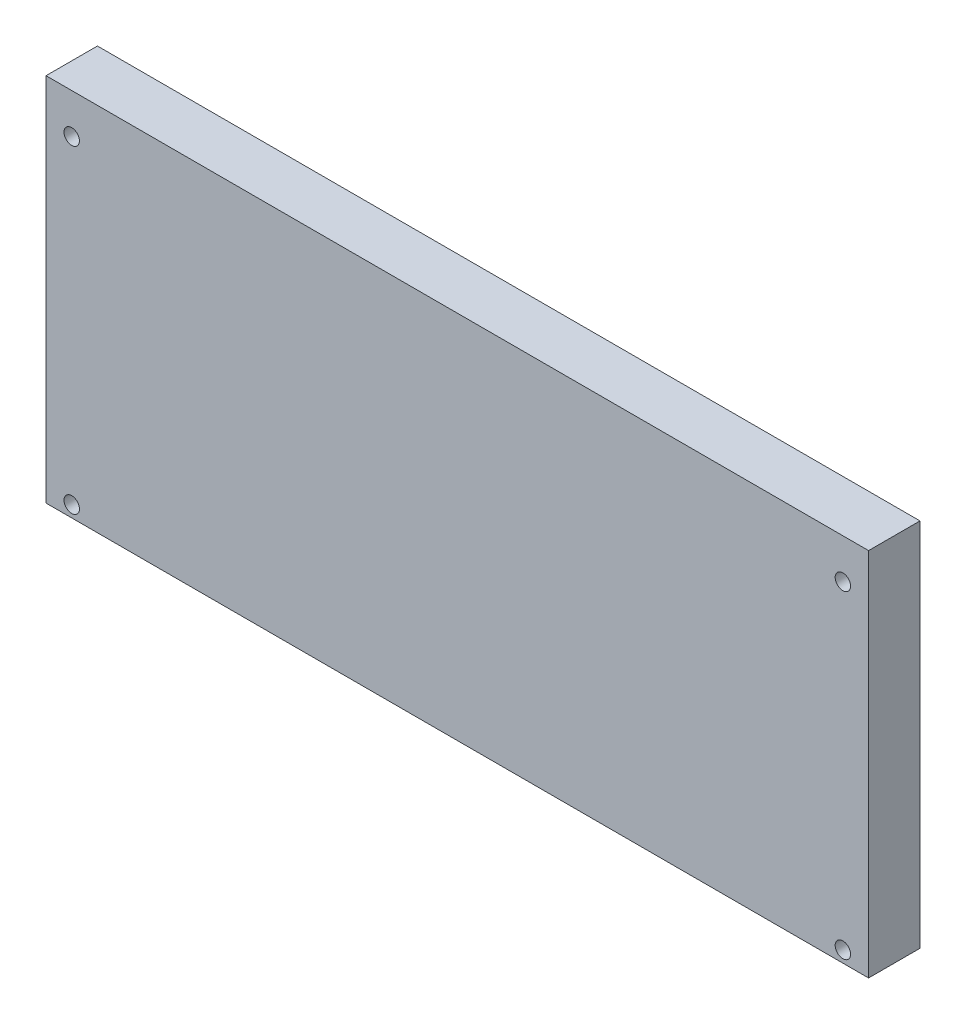
ISO-10303-21;
HEADER;
FILE_DESCRIPTION(('STEP AP214'),'2;1');
FILE_NAME('part.step','',(''),(''),'','','');
FILE_SCHEMA(('AUTOMOTIVE_DESIGN { 1 0 10303 214 1 1 1 1 }'));
ENDSEC;
DATA;
#1=APPLICATION_CONTEXT('core data for automotive mechanical design processes');
#2=APPLICATION_PROTOCOL_DEFINITION('international standard','automotive_design',2000,#1);
#3=PRODUCT_CONTEXT('',#1,'mechanical');
#4=PRODUCT('Part','Part','',(#3));
#5=PRODUCT_RELATED_PRODUCT_CATEGORY('part','',(#4));
#6=PRODUCT_DEFINITION_FORMATION('','',#4);
#7=PRODUCT_DEFINITION_CONTEXT('part definition',#1,'design');
#8=PRODUCT_DEFINITION('design','',#6,#7);
#9=PRODUCT_DEFINITION_SHAPE('','',#8);
#10=(LENGTH_UNIT() NAMED_UNIT(*) SI_UNIT(.MILLI.,.METRE.));
#11=(NAMED_UNIT(*) PLANE_ANGLE_UNIT() SI_UNIT($,.RADIAN.));
#12=(NAMED_UNIT(*) SI_UNIT($,.STERADIAN.) SOLID_ANGLE_UNIT());
#13=UNCERTAINTY_MEASURE_WITH_UNIT(LENGTH_MEASURE(1.E-05),#10,'distance_accuracy_value','');
#14=(GEOMETRIC_REPRESENTATION_CONTEXT(3) GLOBAL_UNCERTAINTY_ASSIGNED_CONTEXT((#13)) GLOBAL_UNIT_ASSIGNED_CONTEXT((#10,
#11,#12)) REPRESENTATION_CONTEXT('',''));
#15=CARTESIAN_POINT('',(0.,0.,0.));
#16=DIRECTION('',(0.,0.,1.));
#17=DIRECTION('',(1.,0.,0.));
#18=AXIS2_PLACEMENT_3D('',#15,#16,#17);
#19=CARTESIAN_POINT('',(0.,0.,0.));
#20=DIRECTION('',(0.,0.,-1.));
#21=DIRECTION('',(-1.,0.,0.));
#22=AXIS2_PLACEMENT_3D('',#19,#20,#21);
#23=PLANE('',#22);
#24=CARTESIAN_POINT('',(336.03196475352,25.5070546999659,0.));
#25=DIRECTION('',(0.,0.,-1.));
#26=DIRECTION('',(-1.,0.,0.));
#27=AXIS2_PLACEMENT_3D('',#24,#25,#26);
#28=CIRCLE('',#27,0.749999999999983);
#29=CARTESIAN_POINT('',(335.28196475352,25.5070546999659,0.));
#30=VERTEX_POINT('',#29);
#31=EDGE_CURVE('E218',#30,#30,#28,.F.);
#32=ORIENTED_EDGE('',*,*,#31,.T.);
#33=EDGE_LOOP('',(#32));
#34=FACE_BOUND('',#33,.T.);
#35=CARTESIAN_POINT('',(336.03196475352,56.5070546999659,0.));
#36=DIRECTION('',(0.,0.,-1.));
#37=DIRECTION('',(-1.,0.,0.));
#38=AXIS2_PLACEMENT_3D('',#35,#36,#37);
#39=CIRCLE('',#38,0.749999999999983);
#40=CARTESIAN_POINT('',(335.28196475352,56.5070546999659,0.));
#41=VERTEX_POINT('',#40);
#42=EDGE_CURVE('E232',#41,#41,#39,.F.);
#43=ORIENTED_EDGE('',*,*,#42,.T.);
#44=EDGE_LOOP('',(#43));
#45=FACE_BOUND('',#44,.T.);
#46=CARTESIAN_POINT('',(261.031964753519,56.5070546999659,0.));
#47=DIRECTION('',(0.,0.,-1.));
#48=DIRECTION('',(-1.,0.,0.));
#49=AXIS2_PLACEMENT_3D('',#46,#47,#48);
#50=CIRCLE('',#49,0.750000000000041);
#51=CARTESIAN_POINT('',(260.281964753519,56.5070546999659,0.));
#52=VERTEX_POINT('',#51);
#53=EDGE_CURVE('E238',#52,#52,#50,.F.);
#54=ORIENTED_EDGE('',*,*,#53,.T.);
#55=EDGE_LOOP('',(#54));
#56=FACE_BOUND('',#55,.T.);
#57=CARTESIAN_POINT('',(261.031964753519,25.5070546999659,0.));
#58=DIRECTION('',(0.,0.,-1.));
#59=DIRECTION('',(-1.,0.,0.));
#60=AXIS2_PLACEMENT_3D('',#57,#58,#59);
#61=CIRCLE('',#60,0.749999999999983);
#62=CARTESIAN_POINT('',(260.28196475352,25.5070546999659,0.));
#63=VERTEX_POINT('',#62);
#64=EDGE_CURVE('E222',#63,#63,#61,.F.);
#65=ORIENTED_EDGE('',*,*,#64,.T.);
#66=EDGE_LOOP('',(#65));
#67=FACE_BOUND('',#66,.T.);
#68=DIRECTION('',(1.,0.,0.));
#69=VECTOR('',#68,1.);
#70=CARTESIAN_POINT('',(338.53196475352,24.3820546999659,0.));
#71=LINE('',#70,#69);
#72=CARTESIAN_POINT('',(258.531964753519,24.3820546999659,0.));
#73=VERTEX_POINT('',#72);
#74=CARTESIAN_POINT('',(338.53196475352,24.3820546999659,0.));
#75=VERTEX_POINT('',#74);
#76=EDGE_CURVE('E132',#73,#75,#71,.T.);
#77=ORIENTED_EDGE('',*,*,#76,.F.);
#78=DIRECTION('',(0.,-1.,0.));
#79=VECTOR('',#78,1.);
#80=CARTESIAN_POINT('',(258.531964753519,24.3820546999659,0.));
#81=LINE('',#80,#79);
#82=CARTESIAN_POINT('',(258.531964753519,60.3820546999659,0.));
#83=VERTEX_POINT('',#82);
#84=EDGE_CURVE('E78',#83,#73,#81,.T.);
#85=ORIENTED_EDGE('',*,*,#84,.F.);
#86=DIRECTION('',(-1.,0.,0.));
#87=VECTOR('',#86,1.);
#88=CARTESIAN_POINT('',(338.53196475352,60.3820546999659,0.));
#89=LINE('',#88,#87);
#90=CARTESIAN_POINT('',(338.53196475352,60.3820546999659,0.));
#91=VERTEX_POINT('',#90);
#92=EDGE_CURVE('E148',#91,#83,#89,.T.);
#93=ORIENTED_EDGE('',*,*,#92,.F.);
#94=DIRECTION('',(0.,1.,0.));
#95=VECTOR('',#94,1.);
#96=CARTESIAN_POINT('',(338.53196475352,24.3820546999659,0.));
#97=LINE('',#96,#95);
#98=EDGE_CURVE('E135',#75,#91,#97,.T.);
#99=ORIENTED_EDGE('',*,*,#98,.F.);
#100=EDGE_LOOP('',(#77,#85,#93,#99));
#101=FACE_BOUND('',#100,.T.);
#102=DIRECTION('',(1.,0.,0.));
#103=VECTOR('',#102,1.);
#104=CARTESIAN_POINT('',(263.101806292503,54.2122131609824,0.));
#105=LINE('',#104,#103);
#106=CARTESIAN_POINT('',(263.101806292503,54.2122131609824,0.));
#107=VERTEX_POINT('',#106);
#108=CARTESIAN_POINT('',(334.101806292503,54.2122131609824,0.));
#109=VERTEX_POINT('',#108);
#110=EDGE_CURVE('E247',#107,#109,#105,.T.);
#111=ORIENTED_EDGE('',*,*,#110,.F.);
#112=DIRECTION('',(0.,1.,0.));
#113=VECTOR('',#112,1.);
#114=CARTESIAN_POINT('',(263.101806292503,30.4122131609824,0.));
#115=LINE('',#114,#113);
#116=CARTESIAN_POINT('',(263.101806292503,30.4122131609824,0.));
#117=VERTEX_POINT('',#116);
#118=EDGE_CURVE('E130',#117,#107,#115,.T.);
#119=ORIENTED_EDGE('',*,*,#118,.F.);
#120=DIRECTION('',(-1.,0.,0.));
#121=VECTOR('',#120,1.);
#122=CARTESIAN_POINT('',(334.101806292503,30.4122131609824,0.));
#123=LINE('',#122,#121);
#124=CARTESIAN_POINT('',(334.101806292503,30.4122131609824,0.));
#125=VERTEX_POINT('',#124);
#126=EDGE_CURVE('E126',#125,#117,#123,.T.);
#127=ORIENTED_EDGE('',*,*,#126,.F.);
#128=DIRECTION('',(0.,-1.,0.));
#129=VECTOR('',#128,1.);
#130=CARTESIAN_POINT('',(334.101806292503,54.2122131609824,0.));
#131=LINE('',#130,#129);
#132=EDGE_CURVE('E249',#109,#125,#131,.T.);
#133=ORIENTED_EDGE('',*,*,#132,.F.);
#134=EDGE_LOOP('',(#111,#119,#127,#133));
#135=FACE_BOUND('',#134,.T.);
#136=ADVANCED_FACE('F33',(#34,#45,#56,#67,#101,#135),#23,.T.);
#137=CARTESIAN_POINT('',(338.53196475352,24.3820546999659,5.));
#138=DIRECTION('',(0.,1.,0.));
#139=DIRECTION('',(-1.,0.,0.));
#140=AXIS2_PLACEMENT_3D('',#137,#138,#139);
#141=PLANE('',#140);
#142=ORIENTED_EDGE('',*,*,#76,.T.);
#143=DIRECTION('',(0.,0.,-1.));
#144=VECTOR('',#143,1.);
#145=CARTESIAN_POINT('',(338.53196475352,24.3820546999659,5.));
#146=LINE('',#145,#144);
#147=CARTESIAN_POINT('',(338.53196475352,24.3820546999659,5.));
#148=VERTEX_POINT('',#147);
#149=EDGE_CURVE('E11',#148,#75,#146,.T.);
#150=ORIENTED_EDGE('',*,*,#149,.F.);
#151=DIRECTION('',(1.,0.,0.));
#152=VECTOR('',#151,1.);
#153=CARTESIAN_POINT('',(338.53196475352,24.3820546999659,5.));
#154=LINE('',#153,#152);
#155=CARTESIAN_POINT('',(258.531964753519,24.3820546999659,5.));
#156=VERTEX_POINT('',#155);
#157=EDGE_CURVE('E140',#156,#148,#154,.T.);
#158=ORIENTED_EDGE('',*,*,#157,.F.);
#159=DIRECTION('',(0.,0.,-1.));
#160=VECTOR('',#159,1.);
#161=CARTESIAN_POINT('',(258.531964753519,24.3820546999659,5.));
#162=LINE('',#161,#160);
#163=EDGE_CURVE('E145',#156,#73,#162,.T.);
#164=ORIENTED_EDGE('',*,*,#163,.T.);
#165=EDGE_LOOP('',(#142,#150,#158,#164));
#166=FACE_BOUND('',#165,.T.);
#167=ADVANCED_FACE('F35',(#166),#141,.F.);
#168=CARTESIAN_POINT('',(338.53196475352,24.3820546999659,5.));
#169=DIRECTION('',(-1.,0.,0.));
#170=DIRECTION('',(0.,0.,1.));
#171=AXIS2_PLACEMENT_3D('',#168,#169,#170);
#172=PLANE('',#171);
#173=ORIENTED_EDGE('',*,*,#98,.T.);
#174=DIRECTION('',(0.,0.,-1.));
#175=VECTOR('',#174,1.);
#176=CARTESIAN_POINT('',(338.53196475352,60.3820546999659,5.));
#177=LINE('',#176,#175);
#178=CARTESIAN_POINT('',(338.53196475352,60.3820546999659,5.));
#179=VERTEX_POINT('',#178);
#180=EDGE_CURVE('E41',#179,#91,#177,.T.);
#181=ORIENTED_EDGE('',*,*,#180,.F.);
#182=DIRECTION('',(0.,1.,0.));
#183=VECTOR('',#182,1.);
#184=CARTESIAN_POINT('',(338.53196475352,24.3820546999659,5.));
#185=LINE('',#184,#183);
#186=EDGE_CURVE('E85',#148,#179,#185,.T.);
#187=ORIENTED_EDGE('',*,*,#186,.F.);
#188=ORIENTED_EDGE('',*,*,#149,.T.);
#189=EDGE_LOOP('',(#173,#181,#187,#188));
#190=FACE_BOUND('',#189,.T.);
#191=ADVANCED_FACE('F175',(#190),#172,.F.);
#192=CARTESIAN_POINT('',(338.53196475352,60.3820546999659,5.));
#193=DIRECTION('',(0.,-1.,0.));
#194=DIRECTION('',(0.,0.,-1.));
#195=AXIS2_PLACEMENT_3D('',#192,#193,#194);
#196=PLANE('',#195);
#197=ORIENTED_EDGE('',*,*,#92,.T.);
#198=DIRECTION('',(0.,0.,-1.));
#199=VECTOR('',#198,1.);
#200=CARTESIAN_POINT('',(258.531964753519,60.3820546999659,5.));
#201=LINE('',#200,#199);
#202=CARTESIAN_POINT('',(258.531964753519,60.3820546999659,5.));
#203=VERTEX_POINT('',#202);
#204=EDGE_CURVE('E152',#203,#83,#201,.T.);
#205=ORIENTED_EDGE('',*,*,#204,.F.);
#206=DIRECTION('',(-1.,0.,0.));
#207=VECTOR('',#206,1.);
#208=CARTESIAN_POINT('',(338.53196475352,60.3820546999659,5.));
#209=LINE('',#208,#207);
#210=EDGE_CURVE('E143',#179,#203,#209,.T.);
#211=ORIENTED_EDGE('',*,*,#210,.F.);
#212=ORIENTED_EDGE('',*,*,#180,.T.);
#213=EDGE_LOOP('',(#197,#205,#211,#212));
#214=FACE_BOUND('',#213,.T.);
#215=ADVANCED_FACE('F157',(#214),#196,.F.);
#216=CARTESIAN_POINT('',(258.531964753519,24.3820546999659,5.));
#217=DIRECTION('',(1.,0.,0.));
#218=DIRECTION('',(0.,0.,-1.));
#219=AXIS2_PLACEMENT_3D('',#216,#217,#218);
#220=PLANE('',#219);
#221=ORIENTED_EDGE('',*,*,#84,.T.);
#222=ORIENTED_EDGE('',*,*,#163,.F.);
#223=DIRECTION('',(0.,-1.,0.));
#224=VECTOR('',#223,1.);
#225=CARTESIAN_POINT('',(258.531964753519,24.3820546999659,5.));
#226=LINE('',#225,#224);
#227=EDGE_CURVE('E57',#203,#156,#226,.T.);
#228=ORIENTED_EDGE('',*,*,#227,.F.);
#229=ORIENTED_EDGE('',*,*,#204,.T.);
#230=EDGE_LOOP('',(#221,#222,#228,#229));
#231=FACE_BOUND('',#230,.T.);
#232=ADVANCED_FACE('F165',(#231),#220,.F.);
#233=CARTESIAN_POINT('',(0.,0.,5.));
#234=DIRECTION('',(0.,0.,-1.));
#235=DIRECTION('',(-1.,0.,0.));
#236=AXIS2_PLACEMENT_3D('',#233,#234,#235);
#237=PLANE('',#236);
#238=CARTESIAN_POINT('',(336.03196475352,25.5070546999659,5.));
#239=DIRECTION('',(0.,0.,1.));
#240=DIRECTION('',(1.,0.,0.));
#241=AXIS2_PLACEMENT_3D('',#238,#239,#240);
#242=CIRCLE('',#241,0.749999999999983);
#243=CARTESIAN_POINT('',(336.781964753519,25.5070546999659,5.));
#244=VERTEX_POINT('',#243);
#245=EDGE_CURVE('E221',#244,#244,#242,.T.);
#246=ORIENTED_EDGE('',*,*,#245,.F.);
#247=EDGE_LOOP('',(#246));
#248=FACE_BOUND('',#247,.T.);
#249=CARTESIAN_POINT('',(336.03196475352,56.5070546999659,5.));
#250=DIRECTION('',(0.,0.,1.));
#251=DIRECTION('',(1.,0.,0.));
#252=AXIS2_PLACEMENT_3D('',#249,#250,#251);
#253=CIRCLE('',#252,0.749999999999983);
#254=CARTESIAN_POINT('',(336.781964753519,56.5070546999659,5.));
#255=VERTEX_POINT('',#254);
#256=EDGE_CURVE('E227',#255,#255,#253,.T.);
#257=ORIENTED_EDGE('',*,*,#256,.F.);
#258=EDGE_LOOP('',(#257));
#259=FACE_BOUND('',#258,.T.);
#260=CARTESIAN_POINT('',(261.031964753519,56.5070546999659,5.));
#261=DIRECTION('',(0.,0.,1.));
#262=DIRECTION('',(1.,0.,0.));
#263=AXIS2_PLACEMENT_3D('',#260,#261,#262);
#264=CIRCLE('',#263,0.750000000000041);
#265=CARTESIAN_POINT('',(261.781964753519,56.5070546999659,5.));
#266=VERTEX_POINT('',#265);
#267=EDGE_CURVE('E235',#266,#266,#264,.T.);
#268=ORIENTED_EDGE('',*,*,#267,.F.);
#269=EDGE_LOOP('',(#268));
#270=FACE_BOUND('',#269,.T.);
#271=CARTESIAN_POINT('',(261.031964753519,25.5070546999659,5.));
#272=DIRECTION('',(0.,0.,1.));
#273=DIRECTION('',(1.,0.,0.));
#274=AXIS2_PLACEMENT_3D('',#271,#272,#273);
#275=CIRCLE('',#274,0.749999999999983);
#276=CARTESIAN_POINT('',(261.781964753519,25.5070546999659,5.));
#277=VERTEX_POINT('',#276);
#278=EDGE_CURVE('E225',#277,#277,#275,.T.);
#279=ORIENTED_EDGE('',*,*,#278,.F.);
#280=EDGE_LOOP('',(#279));
#281=FACE_BOUND('',#280,.T.);
#282=ORIENTED_EDGE('',*,*,#157,.T.);
#283=ORIENTED_EDGE('',*,*,#186,.T.);
#284=ORIENTED_EDGE('',*,*,#210,.T.);
#285=ORIENTED_EDGE('',*,*,#227,.T.);
#286=EDGE_LOOP('',(#282,#283,#284,#285));
#287=FACE_BOUND('',#286,.T.);
#288=ADVANCED_FACE('F167',(#248,#259,#270,#281,#287),#237,.F.);
#289=CARTESIAN_POINT('',(263.101806292503,30.4122131609824,-2.));
#290=DIRECTION('',(1.,0.,0.));
#291=DIRECTION('',(0.,0.,-1.));
#292=AXIS2_PLACEMENT_3D('',#289,#290,#291);
#293=PLANE('',#292);
#294=ORIENTED_EDGE('',*,*,#118,.T.);
#295=DIRECTION('',(0.,0.,1.));
#296=VECTOR('',#295,1.);
#297=CARTESIAN_POINT('',(263.101806292503,54.2122131609824,-2.));
#298=LINE('',#297,#296);
#299=CARTESIAN_POINT('',(263.101806292503,54.2122131609824,-2.));
#300=VERTEX_POINT('',#299);
#301=EDGE_CURVE('E111',#300,#107,#298,.T.);
#302=ORIENTED_EDGE('',*,*,#301,.F.);
#303=DIRECTION('',(0.,1.,0.));
#304=VECTOR('',#303,1.);
#305=CARTESIAN_POINT('',(263.101806292503,30.4122131609824,-2.));
#306=LINE('',#305,#304);
#307=CARTESIAN_POINT('',(263.101806292503,30.4122131609824,-2.));
#308=VERTEX_POINT('',#307);
#309=EDGE_CURVE('E118',#308,#300,#306,.T.);
#310=ORIENTED_EDGE('',*,*,#309,.F.);
#311=DIRECTION('',(0.,0.,1.));
#312=VECTOR('',#311,1.);
#313=CARTESIAN_POINT('',(263.101806292503,30.4122131609824,-2.));
#314=LINE('',#313,#312);
#315=EDGE_CURVE('E245',#308,#117,#314,.T.);
#316=ORIENTED_EDGE('',*,*,#315,.T.);
#317=EDGE_LOOP('',(#294,#302,#310,#316));
#318=FACE_BOUND('',#317,.T.);
#319=ADVANCED_FACE('F128',(#318),#293,.F.);
#320=CARTESIAN_POINT('',(263.101806292503,54.2122131609824,-2.));
#321=DIRECTION('',(0.,-1.,0.));
#322=DIRECTION('',(1.,0.,0.));
#323=AXIS2_PLACEMENT_3D('',#320,#321,#322);
#324=PLANE('',#323);
#325=ORIENTED_EDGE('',*,*,#110,.T.);
#326=DIRECTION('',(0.,0.,1.));
#327=VECTOR('',#326,1.);
#328=CARTESIAN_POINT('',(334.101806292503,54.2122131609824,-2.));
#329=LINE('',#328,#327);
#330=CARTESIAN_POINT('',(334.101806292503,54.2122131609824,-2.));
#331=VERTEX_POINT('',#330);
#332=EDGE_CURVE('E114',#331,#109,#329,.T.);
#333=ORIENTED_EDGE('',*,*,#332,.F.);
#334=DIRECTION('',(1.,0.,0.));
#335=VECTOR('',#334,1.);
#336=CARTESIAN_POINT('',(263.101806292503,54.2122131609824,-2.));
#337=LINE('',#336,#335);
#338=EDGE_CURVE('E107',#300,#331,#337,.T.);
#339=ORIENTED_EDGE('',*,*,#338,.F.);
#340=ORIENTED_EDGE('',*,*,#301,.T.);
#341=EDGE_LOOP('',(#325,#333,#339,#340));
#342=FACE_BOUND('',#341,.T.);
#343=ADVANCED_FACE('F109',(#342),#324,.F.);
#344=CARTESIAN_POINT('',(334.101806292503,54.2122131609824,-2.));
#345=DIRECTION('',(-1.,0.,0.));
#346=DIRECTION('',(0.,0.,1.));
#347=AXIS2_PLACEMENT_3D('',#344,#345,#346);
#348=PLANE('',#347);
#349=ORIENTED_EDGE('',*,*,#132,.T.);
#350=DIRECTION('',(0.,0.,1.));
#351=VECTOR('',#350,1.);
#352=CARTESIAN_POINT('',(334.101806292503,30.4122131609824,-2.));
#353=LINE('',#352,#351);
#354=CARTESIAN_POINT('',(334.101806292503,30.4122131609824,-2.));
#355=VERTEX_POINT('',#354);
#356=EDGE_CURVE('E48',#355,#125,#353,.T.);
#357=ORIENTED_EDGE('',*,*,#356,.F.);
#358=DIRECTION('',(0.,-1.,0.));
#359=VECTOR('',#358,1.);
#360=CARTESIAN_POINT('',(334.101806292503,54.2122131609824,-2.));
#361=LINE('',#360,#359);
#362=EDGE_CURVE('E117',#331,#355,#361,.T.);
#363=ORIENTED_EDGE('',*,*,#362,.F.);
#364=ORIENTED_EDGE('',*,*,#332,.T.);
#365=EDGE_LOOP('',(#349,#357,#363,#364));
#366=FACE_BOUND('',#365,.T.);
#367=ADVANCED_FACE('F190',(#366),#348,.F.);
#368=CARTESIAN_POINT('',(334.101806292503,30.4122131609824,-2.));
#369=DIRECTION('',(0.,1.,0.));
#370=DIRECTION('',(-1.,0.,0.));
#371=AXIS2_PLACEMENT_3D('',#368,#369,#370);
#372=PLANE('',#371);
#373=ORIENTED_EDGE('',*,*,#126,.T.);
#374=ORIENTED_EDGE('',*,*,#315,.F.);
#375=DIRECTION('',(-1.,0.,0.));
#376=VECTOR('',#375,1.);
#377=CARTESIAN_POINT('',(334.101806292503,30.4122131609824,-2.));
#378=LINE('',#377,#376);
#379=EDGE_CURVE('E122',#355,#308,#378,.T.);
#380=ORIENTED_EDGE('',*,*,#379,.F.);
#381=ORIENTED_EDGE('',*,*,#356,.T.);
#382=EDGE_LOOP('',(#373,#374,#380,#381));
#383=FACE_BOUND('',#382,.T.);
#384=ADVANCED_FACE('F193',(#383),#372,.F.);
#385=CARTESIAN_POINT('',(0.,0.,-2.));
#386=DIRECTION('',(0.,0.,-1.));
#387=DIRECTION('',(-1.,0.,0.));
#388=AXIS2_PLACEMENT_3D('',#385,#386,#387);
#389=PLANE('',#388);
#390=ORIENTED_EDGE('',*,*,#309,.T.);
#391=ORIENTED_EDGE('',*,*,#338,.T.);
#392=ORIENTED_EDGE('',*,*,#362,.T.);
#393=ORIENTED_EDGE('',*,*,#379,.T.);
#394=EDGE_LOOP('',(#390,#391,#392,#393));
#395=FACE_BOUND('',#394,.T.);
#396=ADVANCED_FACE('F121',(#395),#389,.T.);
#397=CARTESIAN_POINT('',(261.031964753519,25.5070546999659,-2.001));
#398=DIRECTION('',(0.,0.,1.));
#399=DIRECTION('',(1.,0.,0.));
#400=AXIS2_PLACEMENT_3D('',#397,#398,#399);
#401=CYLINDRICAL_SURFACE('',#400,0.749999999999983);
#402=ORIENTED_EDGE('',*,*,#64,.F.);
#403=EDGE_LOOP('',(#402));
#404=FACE_BOUND('',#403,.T.);
#405=ORIENTED_EDGE('',*,*,#278,.T.);
#406=EDGE_LOOP('',(#405));
#407=FACE_BOUND('',#406,.T.);
#408=ADVANCED_FACE('F199',(#404,#407),#401,.F.);
#409=CARTESIAN_POINT('',(261.031964753519,56.5070546999659,-2.001));
#410=DIRECTION('',(0.,0.,1.));
#411=DIRECTION('',(1.,0.,0.));
#412=AXIS2_PLACEMENT_3D('',#409,#410,#411);
#413=CYLINDRICAL_SURFACE('',#412,0.750000000000041);
#414=ORIENTED_EDGE('',*,*,#53,.F.);
#415=EDGE_LOOP('',(#414));
#416=FACE_BOUND('',#415,.T.);
#417=ORIENTED_EDGE('',*,*,#267,.T.);
#418=EDGE_LOOP('',(#417));
#419=FACE_BOUND('',#418,.T.);
#420=ADVANCED_FACE('F202',(#416,#419),#413,.F.);
#421=CARTESIAN_POINT('',(336.03196475352,56.5070546999659,-2.001));
#422=DIRECTION('',(0.,0.,1.));
#423=DIRECTION('',(1.,0.,0.));
#424=AXIS2_PLACEMENT_3D('',#421,#422,#423);
#425=CYLINDRICAL_SURFACE('',#424,0.749999999999983);
#426=ORIENTED_EDGE('',*,*,#42,.F.);
#427=EDGE_LOOP('',(#426));
#428=FACE_BOUND('',#427,.T.);
#429=ORIENTED_EDGE('',*,*,#256,.T.);
#430=EDGE_LOOP('',(#429));
#431=FACE_BOUND('',#430,.T.);
#432=ADVANCED_FACE('F206',(#428,#431),#425,.F.);
#433=CARTESIAN_POINT('',(336.03196475352,25.5070546999659,-2.001));
#434=DIRECTION('',(0.,0.,1.));
#435=DIRECTION('',(1.,0.,0.));
#436=AXIS2_PLACEMENT_3D('',#433,#434,#435);
#437=CYLINDRICAL_SURFACE('',#436,0.749999999999983);
#438=ORIENTED_EDGE('',*,*,#31,.F.);
#439=EDGE_LOOP('',(#438));
#440=FACE_BOUND('',#439,.T.);
#441=ORIENTED_EDGE('',*,*,#245,.T.);
#442=EDGE_LOOP('',(#441));
#443=FACE_BOUND('',#442,.T.);
#444=ADVANCED_FACE('F210',(#440,#443),#437,.F.);
#445=CLOSED_SHELL('',(#136,#167,#191,#215,#232,#288,#319,#343,#367,#384,#396,#408,#420,#432,#444));
#446=MANIFOLD_SOLID_BREP('B2',#445);
#447=ADVANCED_BREP_SHAPE_REPRESENTATION('',(#18,#446),#14);
#448=SHAPE_DEFINITION_REPRESENTATION(#9,#447);
ENDSEC;
END-ISO-10303-21;
